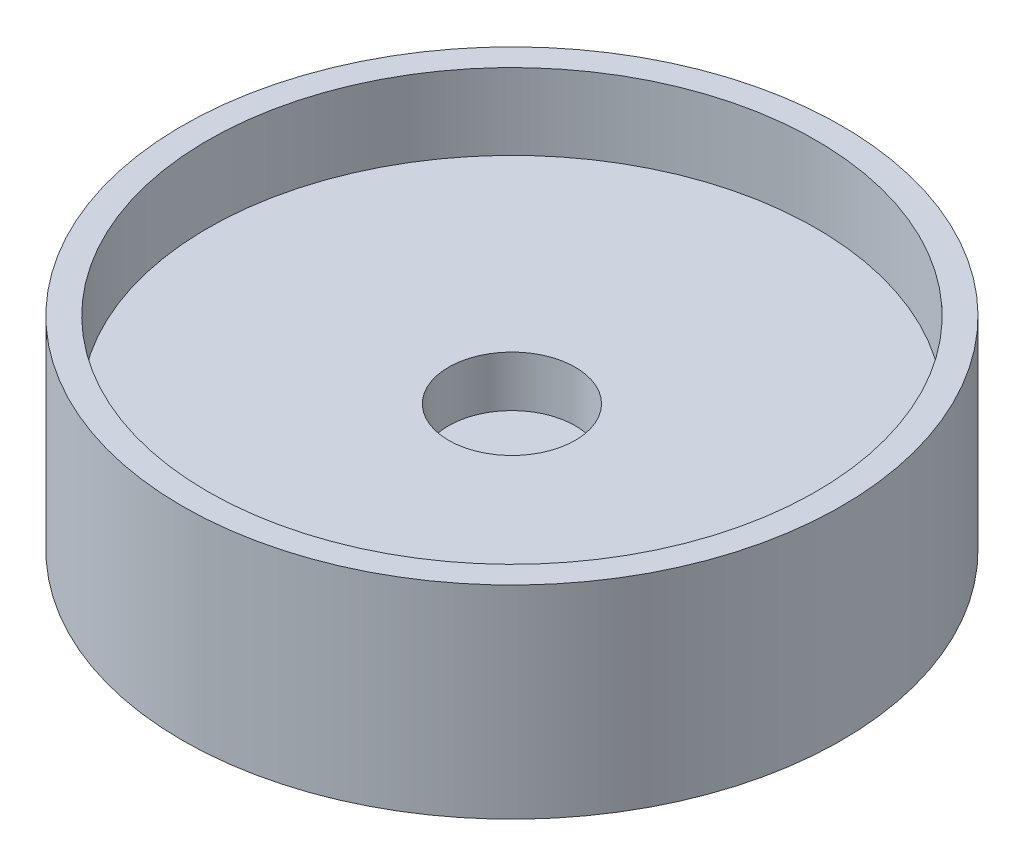
ISO-10303-21;
HEADER;
FILE_DESCRIPTION(('STEP AP214'),'2;1');
FILE_NAME('part.step','',(''),(''),'','','');
FILE_SCHEMA(('AUTOMOTIVE_DESIGN { 1 0 10303 214 1 1 1 1 }'));
ENDSEC;
DATA;
#1=APPLICATION_CONTEXT('core data for automotive mechanical design processes');
#2=APPLICATION_PROTOCOL_DEFINITION('international standard','automotive_design',2000,#1);
#3=PRODUCT_CONTEXT('',#1,'mechanical');
#4=PRODUCT('Part','Part','',(#3));
#5=PRODUCT_RELATED_PRODUCT_CATEGORY('part','',(#4));
#6=PRODUCT_DEFINITION_FORMATION('','',#4);
#7=PRODUCT_DEFINITION_CONTEXT('part definition',#1,'design');
#8=PRODUCT_DEFINITION('design','',#6,#7);
#9=PRODUCT_DEFINITION_SHAPE('','',#8);
#10=(LENGTH_UNIT() NAMED_UNIT(*) SI_UNIT(.MILLI.,.METRE.));
#11=(NAMED_UNIT(*) PLANE_ANGLE_UNIT() SI_UNIT($,.RADIAN.));
#12=(NAMED_UNIT(*) SI_UNIT($,.STERADIAN.) SOLID_ANGLE_UNIT());
#13=UNCERTAINTY_MEASURE_WITH_UNIT(LENGTH_MEASURE(1.E-05),#10,'distance_accuracy_value','');
#14=(GEOMETRIC_REPRESENTATION_CONTEXT(3) GLOBAL_UNCERTAINTY_ASSIGNED_CONTEXT((#13)) GLOBAL_UNIT_ASSIGNED_CONTEXT((#10,
#11,#12)) REPRESENTATION_CONTEXT('',''));
#15=CARTESIAN_POINT('',(0.,0.,0.));
#16=DIRECTION('',(0.,0.,1.));
#17=DIRECTION('',(1.,0.,0.));
#18=AXIS2_PLACEMENT_3D('',#15,#16,#17);
#19=CARTESIAN_POINT('',(0.,8.,0.));
#20=DIRECTION('',(0.,-1.,0.));
#21=DIRECTION('',(0.,0.,-1.));
#22=AXIS2_PLACEMENT_3D('',#19,#20,#21);
#23=CYLINDRICAL_SURFACE('',#22,13.);
#24=CARTESIAN_POINT('',(0.,8.,0.));
#25=DIRECTION('',(0.,1.,0.));
#26=DIRECTION('',(0.,0.,1.));
#27=AXIS2_PLACEMENT_3D('',#24,#25,#26);
#28=CIRCLE('',#27,13.);
#29=CARTESIAN_POINT('',(0.,8.,13.));
#30=VERTEX_POINT('',#29);
#31=EDGE_CURVE('E10',#30,#30,#28,.T.);
#32=ORIENTED_EDGE('',*,*,#31,.F.);
#33=EDGE_LOOP('',(#32));
#34=FACE_BOUND('',#33,.T.);
#35=CARTESIAN_POINT('',(0.,0.,0.));
#36=DIRECTION('',(0.,1.,0.));
#37=DIRECTION('',(0.,0.,1.));
#38=AXIS2_PLACEMENT_3D('',#35,#36,#37);
#39=CIRCLE('',#38,13.);
#40=CARTESIAN_POINT('',(0.,0.,13.));
#41=VERTEX_POINT('',#40);
#42=EDGE_CURVE('E41',#41,#41,#39,.T.);
#43=ORIENTED_EDGE('',*,*,#42,.T.);
#44=EDGE_LOOP('',(#43));
#45=FACE_BOUND('',#44,.T.);
#46=ADVANCED_FACE('F38',(#34,#45),#23,.T.);
#47=CARTESIAN_POINT('',(0.,8.,0.));
#48=DIRECTION('',(0.,1.,0.));
#49=DIRECTION('',(0.,0.,1.));
#50=AXIS2_PLACEMENT_3D('',#47,#48,#49);
#51=PLANE('',#50);
#52=CARTESIAN_POINT('',(0.,8.,0.));
#53=DIRECTION('',(0.,1.,0.));
#54=DIRECTION('',(0.,0.,1.));
#55=AXIS2_PLACEMENT_3D('',#52,#53,#54);
#56=CIRCLE('',#55,12.);
#57=CARTESIAN_POINT('',(0.,8.,12.));
#58=VERTEX_POINT('',#57);
#59=EDGE_CURVE('E52',#58,#58,#56,.T.);
#60=ORIENTED_EDGE('',*,*,#59,.F.);
#61=EDGE_LOOP('',(#60));
#62=FACE_BOUND('',#61,.T.);
#63=ORIENTED_EDGE('',*,*,#31,.T.);
#64=EDGE_LOOP('',(#63));
#65=FACE_BOUND('',#64,.T.);
#66=ADVANCED_FACE('F89',(#62,#65),#51,.T.);
#67=CARTESIAN_POINT('',(0.,0.,0.));
#68=DIRECTION('',(0.,1.,0.));
#69=DIRECTION('',(0.,0.,1.));
#70=AXIS2_PLACEMENT_3D('',#67,#68,#69);
#71=PLANE('',#70);
#72=ORIENTED_EDGE('',*,*,#42,.F.);
#73=EDGE_LOOP('',(#72));
#74=FACE_BOUND('',#73,.T.);
#75=ADVANCED_FACE('F85',(#74),#71,.F.);
#76=CARTESIAN_POINT('',(0.,5.,0.));
#77=DIRECTION('',(0.,1.,0.));
#78=DIRECTION('',(0.,0.,1.));
#79=AXIS2_PLACEMENT_3D('',#76,#77,#78);
#80=CYLINDRICAL_SURFACE('',#79,12.);
#81=CARTESIAN_POINT('',(0.,5.,0.));
#82=DIRECTION('',(0.,1.,0.));
#83=DIRECTION('',(0.,0.,1.));
#84=AXIS2_PLACEMENT_3D('',#81,#82,#83);
#85=CIRCLE('',#84,12.);
#86=CARTESIAN_POINT('',(0.,5.,12.));
#87=VERTEX_POINT('',#86);
#88=EDGE_CURVE('E50',#87,#87,#85,.T.);
#89=ORIENTED_EDGE('',*,*,#88,.F.);
#90=EDGE_LOOP('',(#89));
#91=FACE_BOUND('',#90,.T.);
#92=ORIENTED_EDGE('',*,*,#59,.T.);
#93=EDGE_LOOP('',(#92));
#94=FACE_BOUND('',#93,.T.);
#95=ADVANCED_FACE('F79',(#91,#94),#80,.F.);
#96=CARTESIAN_POINT('',(0.,5.,0.));
#97=DIRECTION('',(0.,1.,0.));
#98=DIRECTION('',(0.,0.,1.));
#99=AXIS2_PLACEMENT_3D('',#96,#97,#98);
#100=PLANE('',#99);
#101=CARTESIAN_POINT('',(0.,5.,0.));
#102=DIRECTION('',(0.,1.,0.));
#103=DIRECTION('',(0.,0.,1.));
#104=AXIS2_PLACEMENT_3D('',#101,#102,#103);
#105=CIRCLE('',#104,2.5);
#106=CARTESIAN_POINT('',(0.,5.,2.5));
#107=VERTEX_POINT('',#106);
#108=EDGE_CURVE('E60',#107,#107,#105,.T.);
#109=ORIENTED_EDGE('',*,*,#108,.F.);
#110=EDGE_LOOP('',(#109));
#111=FACE_BOUND('',#110,.T.);
#112=ORIENTED_EDGE('',*,*,#88,.T.);
#113=EDGE_LOOP('',(#112));
#114=FACE_BOUND('',#113,.T.);
#115=ADVANCED_FACE('F73',(#111,#114),#100,.T.);
#116=CARTESIAN_POINT('',(0.,3.,0.));
#117=DIRECTION('',(0.,1.,0.));
#118=DIRECTION('',(0.,0.,1.));
#119=AXIS2_PLACEMENT_3D('',#116,#117,#118);
#120=CYLINDRICAL_SURFACE('',#119,2.5);
#121=CARTESIAN_POINT('',(0.,3.,0.));
#122=DIRECTION('',(0.,1.,0.));
#123=DIRECTION('',(0.,0.,1.));
#124=AXIS2_PLACEMENT_3D('',#121,#122,#123);
#125=CIRCLE('',#124,2.5);
#126=CARTESIAN_POINT('',(0.,3.,2.5));
#127=VERTEX_POINT('',#126);
#128=EDGE_CURVE('E56',#127,#127,#125,.T.);
#129=ORIENTED_EDGE('',*,*,#128,.F.);
#130=EDGE_LOOP('',(#129));
#131=FACE_BOUND('',#130,.T.);
#132=ORIENTED_EDGE('',*,*,#108,.T.);
#133=EDGE_LOOP('',(#132));
#134=FACE_BOUND('',#133,.T.);
#135=ADVANCED_FACE('F70',(#131,#134),#120,.F.);
#136=CARTESIAN_POINT('',(0.,3.,0.));
#137=DIRECTION('',(0.,1.,0.));
#138=DIRECTION('',(0.,0.,1.));
#139=AXIS2_PLACEMENT_3D('',#136,#137,#138);
#140=PLANE('',#139);
#141=ORIENTED_EDGE('',*,*,#128,.T.);
#142=EDGE_LOOP('',(#141));
#143=FACE_BOUND('',#142,.T.);
#144=ADVANCED_FACE('F68',(#143),#140,.T.);
#145=CLOSED_SHELL('',(#46,#66,#75,#95,#115,#135,#144));
#146=MANIFOLD_SOLID_BREP('B2',#145);
#147=ADVANCED_BREP_SHAPE_REPRESENTATION('',(#18,#146),#14);
#148=SHAPE_DEFINITION_REPRESENTATION(#9,#147);
ENDSEC;
END-ISO-10303-21;
